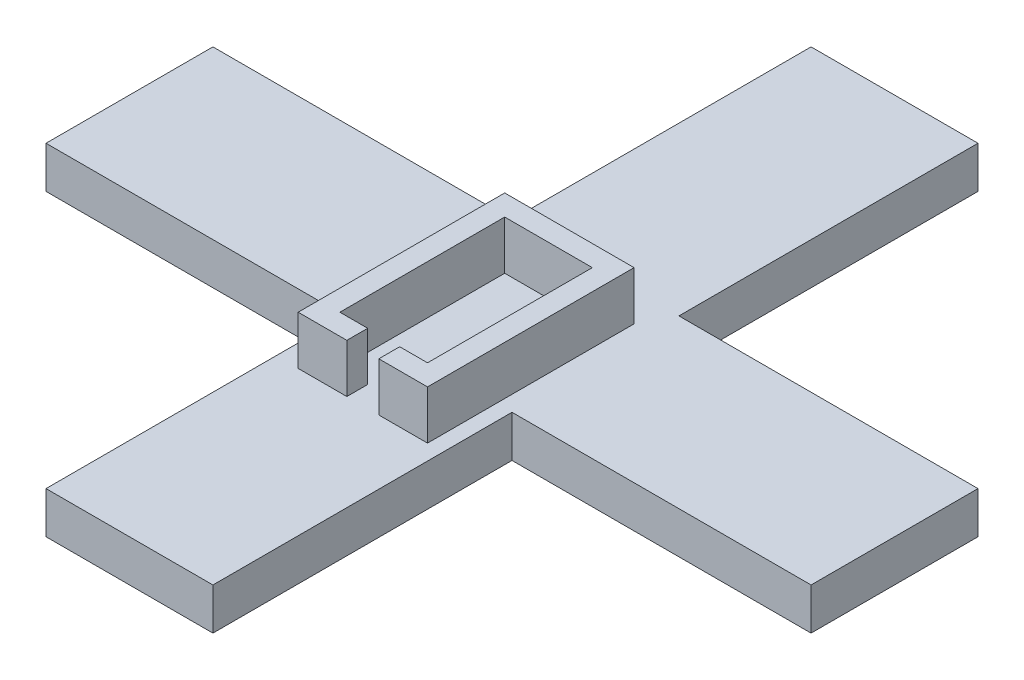
ISO-10303-21;
HEADER;
FILE_DESCRIPTION(('STEP AP214'),'2;1');
FILE_NAME('part.step','',(''),(''),'','','');
FILE_SCHEMA(('AUTOMOTIVE_DESIGN { 1 0 10303 214 1 1 1 1 }'));
ENDSEC;
DATA;
#1=APPLICATION_CONTEXT('core data for automotive mechanical design processes');
#2=APPLICATION_PROTOCOL_DEFINITION('international standard','automotive_design',2000,#1);
#3=PRODUCT_CONTEXT('',#1,'mechanical');
#4=PRODUCT('Part','Part','',(#3));
#5=PRODUCT_RELATED_PRODUCT_CATEGORY('part','',(#4));
#6=PRODUCT_DEFINITION_FORMATION('','',#4);
#7=PRODUCT_DEFINITION_CONTEXT('part definition',#1,'design');
#8=PRODUCT_DEFINITION('design','',#6,#7);
#9=PRODUCT_DEFINITION_SHAPE('','',#8);
#10=(LENGTH_UNIT() NAMED_UNIT(*) SI_UNIT(.MILLI.,.METRE.));
#11=(NAMED_UNIT(*) PLANE_ANGLE_UNIT() SI_UNIT($,.RADIAN.));
#12=(NAMED_UNIT(*) SI_UNIT($,.STERADIAN.) SOLID_ANGLE_UNIT());
#13=UNCERTAINTY_MEASURE_WITH_UNIT(LENGTH_MEASURE(1.E-05),#10,'distance_accuracy_value','');
#14=(GEOMETRIC_REPRESENTATION_CONTEXT(3) GLOBAL_UNCERTAINTY_ASSIGNED_CONTEXT((#13)) GLOBAL_UNIT_ASSIGNED_CONTEXT((#10,
#11,#12)) REPRESENTATION_CONTEXT('',''));
#15=CARTESIAN_POINT('',(0.,0.,0.));
#16=DIRECTION('',(0.,0.,1.));
#17=DIRECTION('',(1.,0.,0.));
#18=AXIS2_PLACEMENT_3D('',#15,#16,#17);
#19=CARTESIAN_POINT('',(0.,6.,0.));
#20=DIRECTION('',(0.,1.,0.));
#21=DIRECTION('',(0.,0.,1.));
#22=AXIS2_PLACEMENT_3D('',#19,#20,#21);
#23=PLANE('',#22);
#24=DIRECTION('',(-1.,0.,0.));
#25=VECTOR('',#24,1.);
#26=CARTESIAN_POINT('',(12.,6.,-55.));
#27=LINE('',#26,#25);
#28=CARTESIAN_POINT('',(12.,6.,-55.));
#29=VERTEX_POINT('',#28);
#30=CARTESIAN_POINT('',(-12.,6.,-55.));
#31=VERTEX_POINT('',#30);
#32=EDGE_CURVE('E115',#29,#31,#27,.T.);
#33=ORIENTED_EDGE('',*,*,#32,.T.);
#34=DIRECTION('',(0.,0.,1.));
#35=VECTOR('',#34,1.);
#36=CARTESIAN_POINT('',(-12.,6.,-55.));
#37=LINE('',#36,#35);
#38=CARTESIAN_POINT('',(-12.,6.,-12.));
#39=VERTEX_POINT('',#38);
#40=EDGE_CURVE('E297',#31,#39,#37,.T.);
#41=ORIENTED_EDGE('',*,*,#40,.T.);
#42=DIRECTION('',(-1.,0.,0.));
#43=VECTOR('',#42,1.);
#44=CARTESIAN_POINT('',(-12.,6.,-12.));
#45=LINE('',#44,#43);
#46=CARTESIAN_POINT('',(-55.,6.,-12.));
#47=VERTEX_POINT('',#46);
#48=EDGE_CURVE('E251',#39,#47,#45,.T.);
#49=ORIENTED_EDGE('',*,*,#48,.T.);
#50=DIRECTION('',(0.,0.,1.));
#51=VECTOR('',#50,1.);
#52=CARTESIAN_POINT('',(-55.,6.,0.));
#53=LINE('',#52,#51);
#54=CARTESIAN_POINT('',(-55.,6.,12.));
#55=VERTEX_POINT('',#54);
#56=EDGE_CURVE('E269',#47,#55,#53,.T.);
#57=ORIENTED_EDGE('',*,*,#56,.T.);
#58=DIRECTION('',(1.,0.,0.));
#59=VECTOR('',#58,1.);
#60=CARTESIAN_POINT('',(-55.,6.,12.));
#61=LINE('',#60,#59);
#62=CARTESIAN_POINT('',(-12.,6.,12.));
#63=VERTEX_POINT('',#62);
#64=EDGE_CURVE('E265',#55,#63,#61,.T.);
#65=ORIENTED_EDGE('',*,*,#64,.T.);
#66=DIRECTION('',(0.,0.,1.));
#67=VECTOR('',#66,1.);
#68=CARTESIAN_POINT('',(-12.,6.,12.));
#69=LINE('',#68,#67);
#70=CARTESIAN_POINT('',(-12.,6.,55.));
#71=VERTEX_POINT('',#70);
#72=EDGE_CURVE('E268',#63,#71,#69,.T.);
#73=ORIENTED_EDGE('',*,*,#72,.T.);
#74=DIRECTION('',(1.,0.,0.));
#75=VECTOR('',#74,1.);
#76=CARTESIAN_POINT('',(-12.,6.,55.));
#77=LINE('',#76,#75);
#78=CARTESIAN_POINT('',(12.,6.,55.));
#79=VERTEX_POINT('',#78);
#80=EDGE_CURVE('E273',#71,#79,#77,.T.);
#81=ORIENTED_EDGE('',*,*,#80,.T.);
#82=DIRECTION('',(0.,0.,-1.));
#83=VECTOR('',#82,1.);
#84=CARTESIAN_POINT('',(12.,6.,55.));
#85=LINE('',#84,#83);
#86=CARTESIAN_POINT('',(12.,6.,12.));
#87=VERTEX_POINT('',#86);
#88=EDGE_CURVE('E280',#79,#87,#85,.T.);
#89=ORIENTED_EDGE('',*,*,#88,.T.);
#90=DIRECTION('',(1.,0.,0.));
#91=VECTOR('',#90,1.);
#92=CARTESIAN_POINT('',(12.,6.,12.));
#93=LINE('',#92,#91);
#94=CARTESIAN_POINT('',(55.,6.,12.));
#95=VERTEX_POINT('',#94);
#96=EDGE_CURVE('E150',#87,#95,#93,.T.);
#97=ORIENTED_EDGE('',*,*,#96,.T.);
#98=DIRECTION('',(0.,0.,-1.));
#99=VECTOR('',#98,1.);
#100=CARTESIAN_POINT('',(55.,6.,0.));
#101=LINE('',#100,#99);
#102=CARTESIAN_POINT('',(55.,6.,-12.));
#103=VERTEX_POINT('',#102);
#104=EDGE_CURVE('E143',#95,#103,#101,.T.);
#105=ORIENTED_EDGE('',*,*,#104,.T.);
#106=DIRECTION('',(-1.,0.,0.));
#107=VECTOR('',#106,1.);
#108=CARTESIAN_POINT('',(55.,6.,-12.));
#109=LINE('',#108,#107);
#110=CARTESIAN_POINT('',(12.,6.,-12.));
#111=VERTEX_POINT('',#110);
#112=EDGE_CURVE('E147',#103,#111,#109,.T.);
#113=ORIENTED_EDGE('',*,*,#112,.T.);
#114=DIRECTION('',(0.,0.,-1.));
#115=VECTOR('',#114,1.);
#116=CARTESIAN_POINT('',(12.,6.,-12.));
#117=LINE('',#116,#115);
#118=EDGE_CURVE('E64',#111,#29,#117,.T.);
#119=ORIENTED_EDGE('',*,*,#118,.T.);
#120=EDGE_LOOP('',(#33,#41,#49,#57,#65,#73,#81,#89,#97,#105,#113,#119));
#121=FACE_BOUND('',#120,.T.);
#122=DIRECTION('',(-1.,0.,0.));
#123=VECTOR('',#122,1.);
#124=CARTESIAN_POINT('',(0.,6.,21.9127301864317));
#125=LINE('',#124,#123);
#126=CARTESIAN_POINT('',(-1.83428157367448,6.,21.9127301864317));
#127=VERTEX_POINT('',#126);
#128=CARTESIAN_POINT('',(-8.83428157367449,6.,21.9127301864317));
#129=VERTEX_POINT('',#128);
#130=EDGE_CURVE('E634',#127,#129,#125,.T.);
#131=ORIENTED_EDGE('',*,*,#130,.T.);
#132=DIRECTION('',(0.,0.,-1.));
#133=VECTOR('',#132,1.);
#134=CARTESIAN_POINT('',(-8.83428157367449,6.,0.));
#135=LINE('',#134,#133);
#136=CARTESIAN_POINT('',(-8.83428157367449,6.,-7.78726981356826));
#137=VERTEX_POINT('',#136);
#138=EDGE_CURVE('E178',#129,#137,#135,.T.);
#139=ORIENTED_EDGE('',*,*,#138,.T.);
#140=DIRECTION('',(1.,0.,0.));
#141=VECTOR('',#140,1.);
#142=CARTESIAN_POINT('',(0.,6.,-7.78726981356826));
#143=LINE('',#142,#141);
#144=CARTESIAN_POINT('',(9.76571842632552,6.,-7.78726981356826));
#145=VERTEX_POINT('',#144);
#146=EDGE_CURVE('E587',#137,#145,#143,.T.);
#147=ORIENTED_EDGE('',*,*,#146,.T.);
#148=DIRECTION('',(0.,0.,1.));
#149=VECTOR('',#148,1.);
#150=CARTESIAN_POINT('',(9.76571842632552,6.,0.));
#151=LINE('',#150,#149);
#152=CARTESIAN_POINT('',(9.76571842632552,6.,21.9127301864317));
#153=VERTEX_POINT('',#152);
#154=EDGE_CURVE('E593',#145,#153,#151,.T.);
#155=ORIENTED_EDGE('',*,*,#154,.T.);
#156=DIRECTION('',(-1.,0.,0.));
#157=VECTOR('',#156,1.);
#158=CARTESIAN_POINT('',(0.,6.,21.9127301864317));
#159=LINE('',#158,#157);
#160=CARTESIAN_POINT('',(2.76571842632552,6.,21.9127301864317));
#161=VERTEX_POINT('',#160);
#162=EDGE_CURVE('E603',#153,#161,#159,.T.);
#163=ORIENTED_EDGE('',*,*,#162,.T.);
#164=DIRECTION('',(0.,0.,-1.));
#165=VECTOR('',#164,1.);
#166=CARTESIAN_POINT('',(2.76571842632552,6.,0.));
#167=LINE('',#166,#165);
#168=CARTESIAN_POINT('',(2.76571842632552,6.,18.9127301864317));
#169=VERTEX_POINT('',#168);
#170=EDGE_CURVE('E607',#161,#169,#167,.T.);
#171=ORIENTED_EDGE('',*,*,#170,.T.);
#172=DIRECTION('',(1.,0.,0.));
#173=VECTOR('',#172,1.);
#174=CARTESIAN_POINT('',(0.,6.,18.9127301864317));
#175=LINE('',#174,#173);
#176=CARTESIAN_POINT('',(6.76571842632552,6.,18.9127301864317));
#177=VERTEX_POINT('',#176);
#178=EDGE_CURVE('E611',#169,#177,#175,.T.);
#179=ORIENTED_EDGE('',*,*,#178,.T.);
#180=DIRECTION('',(0.,0.,-1.));
#181=VECTOR('',#180,1.);
#182=CARTESIAN_POINT('',(6.76571842632552,6.,0.));
#183=LINE('',#182,#181);
#184=CARTESIAN_POINT('',(6.76571842632552,6.,-4.78726981356826));
#185=VERTEX_POINT('',#184);
#186=EDGE_CURVE('E615',#177,#185,#183,.T.);
#187=ORIENTED_EDGE('',*,*,#186,.T.);
#188=DIRECTION('',(-1.,0.,0.));
#189=VECTOR('',#188,1.);
#190=CARTESIAN_POINT('',(0.,6.,-4.78726981356826));
#191=LINE('',#190,#189);
#192=CARTESIAN_POINT('',(-5.83428157367449,6.,-4.78726981356826));
#193=VERTEX_POINT('',#192);
#194=EDGE_CURVE('E619',#185,#193,#191,.T.);
#195=ORIENTED_EDGE('',*,*,#194,.T.);
#196=DIRECTION('',(0.,0.,1.));
#197=VECTOR('',#196,1.);
#198=CARTESIAN_POINT('',(-5.83428157367449,6.,0.));
#199=LINE('',#198,#197);
#200=CARTESIAN_POINT('',(-5.83428157367448,6.,18.9127301864317));
#201=VERTEX_POINT('',#200);
#202=EDGE_CURVE('E623',#193,#201,#199,.T.);
#203=ORIENTED_EDGE('',*,*,#202,.T.);
#204=DIRECTION('',(1.,0.,0.));
#205=VECTOR('',#204,1.);
#206=CARTESIAN_POINT('',(0.,6.,18.9127301864317));
#207=LINE('',#206,#205);
#208=CARTESIAN_POINT('',(-1.83428157367448,6.,18.9127301864317));
#209=VERTEX_POINT('',#208);
#210=EDGE_CURVE('E627',#201,#209,#207,.T.);
#211=ORIENTED_EDGE('',*,*,#210,.T.);
#212=DIRECTION('',(0.,0.,1.));
#213=VECTOR('',#212,1.);
#214=CARTESIAN_POINT('',(-1.83428157367448,6.,0.));
#215=LINE('',#214,#213);
#216=EDGE_CURVE('E631',#209,#127,#215,.T.);
#217=ORIENTED_EDGE('',*,*,#216,.T.);
#218=EDGE_LOOP('',(#131,#139,#147,#155,#163,#171,#179,#187,#195,#203,#211,#217));
#219=FACE_BOUND('',#218,.T.);
#220=ADVANCED_FACE('F39',(#121,#219),#23,.T.);
#221=CARTESIAN_POINT('',(0.,6.,-55.));
#222=DIRECTION('',(0.,0.,1.));
#223=DIRECTION('',(1.,0.,0.));
#224=AXIS2_PLACEMENT_3D('',#221,#222,#223);
#225=PLANE('',#224);
#226=DIRECTION('',(-1.,0.,0.));
#227=VECTOR('',#226,1.);
#228=CARTESIAN_POINT('',(0.,0.,-55.));
#229=LINE('',#228,#227);
#230=CARTESIAN_POINT('',(12.,0.,-55.));
#231=VERTEX_POINT('',#230);
#232=CARTESIAN_POINT('',(-12.,0.,-55.));
#233=VERTEX_POINT('',#232);
#234=EDGE_CURVE('E109',#231,#233,#229,.T.);
#235=ORIENTED_EDGE('',*,*,#234,.T.);
#236=DIRECTION('',(0.,-1.,0.));
#237=VECTOR('',#236,1.);
#238=CARTESIAN_POINT('',(-12.,6.,-55.));
#239=LINE('',#238,#237);
#240=EDGE_CURVE('E11',#31,#233,#239,.T.);
#241=ORIENTED_EDGE('',*,*,#240,.F.);
#242=ORIENTED_EDGE('',*,*,#32,.F.);
#243=DIRECTION('',(0.,-1.,0.));
#244=VECTOR('',#243,1.);
#245=CARTESIAN_POINT('',(12.,6.,-55.));
#246=LINE('',#245,#244);
#247=EDGE_CURVE('E171',#29,#231,#246,.T.);
#248=ORIENTED_EDGE('',*,*,#247,.T.);
#249=EDGE_LOOP('',(#235,#241,#242,#248));
#250=FACE_BOUND('',#249,.T.);
#251=ADVANCED_FACE('F41',(#250),#225,.F.);
#252=CARTESIAN_POINT('',(-12.,6.,-55.));
#253=DIRECTION('',(1.,0.,0.));
#254=DIRECTION('',(0.,0.,-1.));
#255=AXIS2_PLACEMENT_3D('',#252,#253,#254);
#256=PLANE('',#255);
#257=DIRECTION('',(0.,0.,1.));
#258=VECTOR('',#257,1.);
#259=CARTESIAN_POINT('',(-12.,0.,-55.));
#260=LINE('',#259,#258);
#261=CARTESIAN_POINT('',(-12.,0.,-12.));
#262=VERTEX_POINT('',#261);
#263=EDGE_CURVE('E177',#233,#262,#260,.T.);
#264=ORIENTED_EDGE('',*,*,#263,.T.);
#265=DIRECTION('',(0.,-1.,0.));
#266=VECTOR('',#265,1.);
#267=CARTESIAN_POINT('',(-12.,6.,-12.));
#268=LINE('',#267,#266);
#269=EDGE_CURVE('E48',#39,#262,#268,.T.);
#270=ORIENTED_EDGE('',*,*,#269,.F.);
#271=ORIENTED_EDGE('',*,*,#40,.F.);
#272=ORIENTED_EDGE('',*,*,#240,.T.);
#273=EDGE_LOOP('',(#264,#270,#271,#272));
#274=FACE_BOUND('',#273,.T.);
#275=ADVANCED_FACE('F304',(#274),#256,.F.);
#276=CARTESIAN_POINT('',(-12.,6.,-12.));
#277=DIRECTION('',(0.,0.,1.));
#278=DIRECTION('',(1.,0.,0.));
#279=AXIS2_PLACEMENT_3D('',#276,#277,#278);
#280=PLANE('',#279);
#281=DIRECTION('',(-1.,0.,0.));
#282=VECTOR('',#281,1.);
#283=CARTESIAN_POINT('',(-12.,0.,-12.));
#284=LINE('',#283,#282);
#285=CARTESIAN_POINT('',(-55.,0.,-12.));
#286=VERTEX_POINT('',#285);
#287=EDGE_CURVE('E181',#262,#286,#284,.T.);
#288=ORIENTED_EDGE('',*,*,#287,.T.);
#289=DIRECTION('',(0.,-1.,0.));
#290=VECTOR('',#289,1.);
#291=CARTESIAN_POINT('',(-55.,6.,-12.));
#292=LINE('',#291,#290);
#293=EDGE_CURVE('E240',#47,#286,#292,.T.);
#294=ORIENTED_EDGE('',*,*,#293,.F.);
#295=ORIENTED_EDGE('',*,*,#48,.F.);
#296=ORIENTED_EDGE('',*,*,#269,.T.);
#297=EDGE_LOOP('',(#288,#294,#295,#296));
#298=FACE_BOUND('',#297,.T.);
#299=ADVANCED_FACE('F249',(#298),#280,.F.);
#300=CARTESIAN_POINT('',(-55.,6.,12.));
#301=DIRECTION('',(1.,0.,0.));
#302=DIRECTION('',(0.,0.,-1.));
#303=AXIS2_PLACEMENT_3D('',#300,#301,#302);
#304=PLANE('',#303);
#305=DIRECTION('',(0.,0.,1.));
#306=VECTOR('',#305,1.);
#307=CARTESIAN_POINT('',(-55.,0.,12.));
#308=LINE('',#307,#306);
#309=CARTESIAN_POINT('',(-55.,0.,12.));
#310=VERTEX_POINT('',#309);
#311=EDGE_CURVE('E185',#286,#310,#308,.T.);
#312=ORIENTED_EDGE('',*,*,#311,.T.);
#313=DIRECTION('',(0.,-1.,0.));
#314=VECTOR('',#313,1.);
#315=CARTESIAN_POINT('',(-55.,6.,12.));
#316=LINE('',#315,#314);
#317=EDGE_CURVE('E236',#55,#310,#316,.T.);
#318=ORIENTED_EDGE('',*,*,#317,.F.);
#319=ORIENTED_EDGE('',*,*,#56,.F.);
#320=ORIENTED_EDGE('',*,*,#293,.T.);
#321=EDGE_LOOP('',(#312,#318,#319,#320));
#322=FACE_BOUND('',#321,.T.);
#323=ADVANCED_FACE('F259',(#322),#304,.F.);
#324=CARTESIAN_POINT('',(-55.,6.,12.));
#325=DIRECTION('',(0.,0.,-1.));
#326=DIRECTION('',(-1.,0.,0.));
#327=AXIS2_PLACEMENT_3D('',#324,#325,#326);
#328=PLANE('',#327);
#329=DIRECTION('',(1.,0.,0.));
#330=VECTOR('',#329,1.);
#331=CARTESIAN_POINT('',(-55.,0.,12.));
#332=LINE('',#331,#330);
#333=CARTESIAN_POINT('',(-12.,0.,12.));
#334=VERTEX_POINT('',#333);
#335=EDGE_CURVE('E188',#310,#334,#332,.T.);
#336=ORIENTED_EDGE('',*,*,#335,.T.);
#337=DIRECTION('',(0.,-1.,0.));
#338=VECTOR('',#337,1.);
#339=CARTESIAN_POINT('',(-12.,6.,12.));
#340=LINE('',#339,#338);
#341=EDGE_CURVE('E232',#63,#334,#340,.T.);
#342=ORIENTED_EDGE('',*,*,#341,.F.);
#343=ORIENTED_EDGE('',*,*,#64,.F.);
#344=ORIENTED_EDGE('',*,*,#317,.T.);
#345=EDGE_LOOP('',(#336,#342,#343,#344));
#346=FACE_BOUND('',#345,.T.);
#347=ADVANCED_FACE('F263',(#346),#328,.F.);
#348=CARTESIAN_POINT('',(-12.,6.,12.));
#349=DIRECTION('',(1.,0.,0.));
#350=DIRECTION('',(0.,0.,-1.));
#351=AXIS2_PLACEMENT_3D('',#348,#349,#350);
#352=PLANE('',#351);
#353=DIRECTION('',(0.,0.,1.));
#354=VECTOR('',#353,1.);
#355=CARTESIAN_POINT('',(-12.,0.,12.));
#356=LINE('',#355,#354);
#357=CARTESIAN_POINT('',(-12.,0.,55.));
#358=VERTEX_POINT('',#357);
#359=EDGE_CURVE('E191',#334,#358,#356,.T.);
#360=ORIENTED_EDGE('',*,*,#359,.T.);
#361=DIRECTION('',(0.,-1.,0.));
#362=VECTOR('',#361,1.);
#363=CARTESIAN_POINT('',(-12.,6.,55.));
#364=LINE('',#363,#362);
#365=EDGE_CURVE('E228',#71,#358,#364,.T.);
#366=ORIENTED_EDGE('',*,*,#365,.F.);
#367=ORIENTED_EDGE('',*,*,#72,.F.);
#368=ORIENTED_EDGE('',*,*,#341,.T.);
#369=EDGE_LOOP('',(#360,#366,#367,#368));
#370=FACE_BOUND('',#369,.T.);
#371=ADVANCED_FACE('F334',(#370),#352,.F.);
#372=CARTESIAN_POINT('',(0.,6.,55.));
#373=DIRECTION('',(0.,0.,-1.));
#374=DIRECTION('',(-1.,0.,0.));
#375=AXIS2_PLACEMENT_3D('',#372,#373,#374);
#376=PLANE('',#375);
#377=DIRECTION('',(1.,0.,0.));
#378=VECTOR('',#377,1.);
#379=CARTESIAN_POINT('',(0.,0.,55.));
#380=LINE('',#379,#378);
#381=CARTESIAN_POINT('',(12.,0.,55.));
#382=VERTEX_POINT('',#381);
#383=EDGE_CURVE('E195',#358,#382,#380,.T.);
#384=ORIENTED_EDGE('',*,*,#383,.T.);
#385=DIRECTION('',(0.,-1.,0.));
#386=VECTOR('',#385,1.);
#387=CARTESIAN_POINT('',(12.,6.,55.));
#388=LINE('',#387,#386);
#389=EDGE_CURVE('E224',#79,#382,#388,.T.);
#390=ORIENTED_EDGE('',*,*,#389,.F.);
#391=ORIENTED_EDGE('',*,*,#80,.F.);
#392=ORIENTED_EDGE('',*,*,#365,.T.);
#393=EDGE_LOOP('',(#384,#390,#391,#392));
#394=FACE_BOUND('',#393,.T.);
#395=ADVANCED_FACE('F331',(#394),#376,.F.);
#396=CARTESIAN_POINT('',(12.,6.,55.));
#397=DIRECTION('',(-1.,0.,0.));
#398=DIRECTION('',(0.,0.,1.));
#399=AXIS2_PLACEMENT_3D('',#396,#397,#398);
#400=PLANE('',#399);
#401=DIRECTION('',(0.,0.,-1.));
#402=VECTOR('',#401,1.);
#403=CARTESIAN_POINT('',(12.,0.,55.));
#404=LINE('',#403,#402);
#405=CARTESIAN_POINT('',(12.,0.,12.));
#406=VERTEX_POINT('',#405);
#407=EDGE_CURVE('E198',#382,#406,#404,.T.);
#408=ORIENTED_EDGE('',*,*,#407,.T.);
#409=DIRECTION('',(0.,-1.,0.));
#410=VECTOR('',#409,1.);
#411=CARTESIAN_POINT('',(12.,6.,12.));
#412=LINE('',#411,#410);
#413=EDGE_CURVE('E220',#87,#406,#412,.T.);
#414=ORIENTED_EDGE('',*,*,#413,.F.);
#415=ORIENTED_EDGE('',*,*,#88,.F.);
#416=ORIENTED_EDGE('',*,*,#389,.T.);
#417=EDGE_LOOP('',(#408,#414,#415,#416));
#418=FACE_BOUND('',#417,.T.);
#419=ADVANCED_FACE('F288',(#418),#400,.F.);
#420=CARTESIAN_POINT('',(12.,6.,12.));
#421=DIRECTION('',(0.,0.,-1.));
#422=DIRECTION('',(-1.,0.,0.));
#423=AXIS2_PLACEMENT_3D('',#420,#421,#422);
#424=PLANE('',#423);
#425=DIRECTION('',(1.,0.,0.));
#426=VECTOR('',#425,1.);
#427=CARTESIAN_POINT('',(12.,0.,12.));
#428=LINE('',#427,#426);
#429=CARTESIAN_POINT('',(55.,0.,12.));
#430=VERTEX_POINT('',#429);
#431=EDGE_CURVE('E201',#406,#430,#428,.T.);
#432=ORIENTED_EDGE('',*,*,#431,.T.);
#433=DIRECTION('',(0.,-1.,0.));
#434=VECTOR('',#433,1.);
#435=CARTESIAN_POINT('',(55.,6.,12.));
#436=LINE('',#435,#434);
#437=EDGE_CURVE('E163',#95,#430,#436,.T.);
#438=ORIENTED_EDGE('',*,*,#437,.F.);
#439=ORIENTED_EDGE('',*,*,#96,.F.);
#440=ORIENTED_EDGE('',*,*,#413,.T.);
#441=EDGE_LOOP('',(#432,#438,#439,#440));
#442=FACE_BOUND('',#441,.T.);
#443=ADVANCED_FACE('F292',(#442),#424,.F.);
#444=CARTESIAN_POINT('',(55.,6.,0.));
#445=DIRECTION('',(-1.,0.,0.));
#446=DIRECTION('',(0.,0.,1.));
#447=AXIS2_PLACEMENT_3D('',#444,#445,#446);
#448=PLANE('',#447);
#449=DIRECTION('',(0.,0.,-1.));
#450=VECTOR('',#449,1.);
#451=CARTESIAN_POINT('',(55.,0.,0.));
#452=LINE('',#451,#450);
#453=CARTESIAN_POINT('',(55.,0.,-12.));
#454=VERTEX_POINT('',#453);
#455=EDGE_CURVE('E159',#430,#454,#452,.T.);
#456=ORIENTED_EDGE('',*,*,#455,.T.);
#457=DIRECTION('',(0.,-1.,0.));
#458=VECTOR('',#457,1.);
#459=CARTESIAN_POINT('',(55.,6.,-12.));
#460=LINE('',#459,#458);
#461=EDGE_CURVE('E157',#103,#454,#460,.T.);
#462=ORIENTED_EDGE('',*,*,#461,.F.);
#463=ORIENTED_EDGE('',*,*,#104,.F.);
#464=ORIENTED_EDGE('',*,*,#437,.T.);
#465=EDGE_LOOP('',(#456,#462,#463,#464));
#466=FACE_BOUND('',#465,.T.);
#467=ADVANCED_FACE('F158',(#466),#448,.F.);
#468=CARTESIAN_POINT('',(55.,6.,-12.));
#469=DIRECTION('',(0.,0.,1.));
#470=DIRECTION('',(1.,0.,0.));
#471=AXIS2_PLACEMENT_3D('',#468,#469,#470);
#472=PLANE('',#471);
#473=DIRECTION('',(-1.,0.,0.));
#474=VECTOR('',#473,1.);
#475=CARTESIAN_POINT('',(55.,0.,-12.));
#476=LINE('',#475,#474);
#477=CARTESIAN_POINT('',(12.,0.,-12.));
#478=VERTEX_POINT('',#477);
#479=EDGE_CURVE('E207',#454,#478,#476,.T.);
#480=ORIENTED_EDGE('',*,*,#479,.T.);
#481=DIRECTION('',(0.,-1.,0.));
#482=VECTOR('',#481,1.);
#483=CARTESIAN_POINT('',(12.,6.,-12.));
#484=LINE('',#483,#482);
#485=EDGE_CURVE('E164',#111,#478,#484,.T.);
#486=ORIENTED_EDGE('',*,*,#485,.F.);
#487=ORIENTED_EDGE('',*,*,#112,.F.);
#488=ORIENTED_EDGE('',*,*,#461,.T.);
#489=EDGE_LOOP('',(#480,#486,#487,#488));
#490=FACE_BOUND('',#489,.T.);
#491=ADVANCED_FACE('F166',(#490),#472,.F.);
#492=CARTESIAN_POINT('',(12.,6.,-12.));
#493=DIRECTION('',(-1.,0.,0.));
#494=DIRECTION('',(0.,0.,1.));
#495=AXIS2_PLACEMENT_3D('',#492,#493,#494);
#496=PLANE('',#495);
#497=DIRECTION('',(0.,0.,-1.));
#498=VECTOR('',#497,1.);
#499=CARTESIAN_POINT('',(12.,0.,-12.));
#500=LINE('',#499,#498);
#501=EDGE_CURVE('E210',#478,#231,#500,.T.);
#502=ORIENTED_EDGE('',*,*,#501,.T.);
#503=ORIENTED_EDGE('',*,*,#247,.F.);
#504=ORIENTED_EDGE('',*,*,#118,.F.);
#505=ORIENTED_EDGE('',*,*,#485,.T.);
#506=EDGE_LOOP('',(#502,#503,#504,#505));
#507=FACE_BOUND('',#506,.T.);
#508=ADVANCED_FACE('F294',(#507),#496,.F.);
#509=CARTESIAN_POINT('',(0.,0.,0.));
#510=DIRECTION('',(0.,1.,0.));
#511=DIRECTION('',(0.,0.,1.));
#512=AXIS2_PLACEMENT_3D('',#509,#510,#511);
#513=PLANE('',#512);
#514=ORIENTED_EDGE('',*,*,#234,.F.);
#515=ORIENTED_EDGE('',*,*,#501,.F.);
#516=ORIENTED_EDGE('',*,*,#479,.F.);
#517=ORIENTED_EDGE('',*,*,#455,.F.);
#518=ORIENTED_EDGE('',*,*,#431,.F.);
#519=ORIENTED_EDGE('',*,*,#407,.F.);
#520=ORIENTED_EDGE('',*,*,#383,.F.);
#521=ORIENTED_EDGE('',*,*,#359,.F.);
#522=ORIENTED_EDGE('',*,*,#335,.F.);
#523=ORIENTED_EDGE('',*,*,#311,.F.);
#524=ORIENTED_EDGE('',*,*,#287,.F.);
#525=ORIENTED_EDGE('',*,*,#263,.F.);
#526=EDGE_LOOP('',(#514,#515,#516,#517,#518,#519,#520,#521,#522,#523,#524,#525));
#527=FACE_BOUND('',#526,.T.);
#528=ADVANCED_FACE('F254',(#527),#513,.F.);
#529=CARTESIAN_POINT('',(-8.83428157367449,13.,21.9127301864317));
#530=DIRECTION('',(1.,0.,0.));
#531=DIRECTION('',(0.,0.,-1.));
#532=AXIS2_PLACEMENT_3D('',#529,#530,#531);
#533=PLANE('',#532);
#534=ORIENTED_EDGE('',*,*,#138,.F.);
#535=DIRECTION('',(0.,-1.,0.));
#536=VECTOR('',#535,1.);
#537=CARTESIAN_POINT('',(-8.83428157367449,13.,21.9127301864317));
#538=LINE('',#537,#536);
#539=CARTESIAN_POINT('',(-8.83428157367449,13.,21.9127301864317));
#540=VERTEX_POINT('',#539);
#541=EDGE_CURVE('E582',#540,#129,#538,.T.);
#542=ORIENTED_EDGE('',*,*,#541,.F.);
#543=DIRECTION('',(0.,0.,1.));
#544=VECTOR('',#543,1.);
#545=CARTESIAN_POINT('',(-8.83428157367449,13.,21.9127301864317));
#546=LINE('',#545,#544);
#547=CARTESIAN_POINT('',(-8.83428157367449,13.,-7.78726981356826));
#548=VERTEX_POINT('',#547);
#549=EDGE_CURVE('E565',#548,#540,#546,.T.);
#550=ORIENTED_EDGE('',*,*,#549,.F.);
#551=DIRECTION('',(0.,-1.,0.));
#552=VECTOR('',#551,1.);
#553=CARTESIAN_POINT('',(-8.83428157367449,13.,-7.78726981356826));
#554=LINE('',#553,#552);
#555=EDGE_CURVE('E710',#548,#137,#554,.T.);
#556=ORIENTED_EDGE('',*,*,#555,.T.);
#557=EDGE_LOOP('',(#534,#542,#550,#556));
#558=FACE_BOUND('',#557,.T.);
#559=ADVANCED_FACE('F317',(#558),#533,.F.);
#560=CARTESIAN_POINT('',(-1.83428157367448,13.,21.9127301864317));
#561=DIRECTION('',(0.,0.,-1.));
#562=DIRECTION('',(-1.,0.,0.));
#563=AXIS2_PLACEMENT_3D('',#560,#561,#562);
#564=PLANE('',#563);
#565=ORIENTED_EDGE('',*,*,#130,.F.);
#566=DIRECTION('',(0.,-1.,0.));
#567=VECTOR('',#566,1.);
#568=CARTESIAN_POINT('',(-1.83428157367448,13.,21.9127301864317));
#569=LINE('',#568,#567);
#570=CARTESIAN_POINT('',(-1.83428157367448,13.,21.9127301864317));
#571=VERTEX_POINT('',#570);
#572=EDGE_CURVE('E588',#571,#127,#569,.T.);
#573=ORIENTED_EDGE('',*,*,#572,.F.);
#574=DIRECTION('',(1.,0.,0.));
#575=VECTOR('',#574,1.);
#576=CARTESIAN_POINT('',(-1.83428157367448,13.,21.9127301864317));
#577=LINE('',#576,#575);
#578=EDGE_CURVE('E570',#540,#571,#577,.T.);
#579=ORIENTED_EDGE('',*,*,#578,.F.);
#580=ORIENTED_EDGE('',*,*,#541,.T.);
#581=EDGE_LOOP('',(#565,#573,#579,#580));
#582=FACE_BOUND('',#581,.T.);
#583=ADVANCED_FACE('F388',(#582),#564,.F.);
#584=CARTESIAN_POINT('',(-1.83428157367448,13.,18.9127301864317));
#585=DIRECTION('',(-1.,0.,0.));
#586=DIRECTION('',(0.,0.,1.));
#587=AXIS2_PLACEMENT_3D('',#584,#585,#586);
#588=PLANE('',#587);
#589=ORIENTED_EDGE('',*,*,#216,.F.);
#590=DIRECTION('',(0.,-1.,0.));
#591=VECTOR('',#590,1.);
#592=CARTESIAN_POINT('',(-1.83428157367448,13.,18.9127301864317));
#593=LINE('',#592,#591);
#594=CARTESIAN_POINT('',(-1.83428157367448,13.,18.9127301864317));
#595=VERTEX_POINT('',#594);
#596=EDGE_CURVE('E596',#595,#209,#593,.T.);
#597=ORIENTED_EDGE('',*,*,#596,.F.);
#598=DIRECTION('',(0.,0.,-1.));
#599=VECTOR('',#598,1.);
#600=CARTESIAN_POINT('',(-1.83428157367448,13.,18.9127301864317));
#601=LINE('',#600,#599);
#602=EDGE_CURVE('E670',#571,#595,#601,.T.);
#603=ORIENTED_EDGE('',*,*,#602,.F.);
#604=ORIENTED_EDGE('',*,*,#572,.T.);
#605=EDGE_LOOP('',(#589,#597,#603,#604));
#606=FACE_BOUND('',#605,.T.);
#607=ADVANCED_FACE('F395',(#606),#588,.F.);
#608=CARTESIAN_POINT('',(-5.83428157367448,13.,18.9127301864317));
#609=DIRECTION('',(0.,0.,1.));
#610=DIRECTION('',(1.,0.,0.));
#611=AXIS2_PLACEMENT_3D('',#608,#609,#610);
#612=PLANE('',#611);
#613=ORIENTED_EDGE('',*,*,#210,.F.);
#614=DIRECTION('',(0.,-1.,0.));
#615=VECTOR('',#614,1.);
#616=CARTESIAN_POINT('',(-5.83428157367448,13.,18.9127301864317));
#617=LINE('',#616,#615);
#618=CARTESIAN_POINT('',(-5.83428157367448,13.,18.9127301864317));
#619=VERTEX_POINT('',#618);
#620=EDGE_CURVE('E675',#619,#201,#617,.T.);
#621=ORIENTED_EDGE('',*,*,#620,.F.);
#622=DIRECTION('',(-1.,0.,0.));
#623=VECTOR('',#622,1.);
#624=CARTESIAN_POINT('',(-5.83428157367448,13.,18.9127301864317));
#625=LINE('',#624,#623);
#626=EDGE_CURVE('E740',#595,#619,#625,.T.);
#627=ORIENTED_EDGE('',*,*,#626,.F.);
#628=ORIENTED_EDGE('',*,*,#596,.T.);
#629=EDGE_LOOP('',(#613,#621,#627,#628));
#630=FACE_BOUND('',#629,.T.);
#631=ADVANCED_FACE('F402',(#630),#612,.F.);
#632=CARTESIAN_POINT('',(-5.83428157367449,13.,-4.78726981356826));
#633=DIRECTION('',(-1.,0.,0.));
#634=DIRECTION('',(0.,0.,1.));
#635=AXIS2_PLACEMENT_3D('',#632,#633,#634);
#636=PLANE('',#635);
#637=ORIENTED_EDGE('',*,*,#202,.F.);
#638=DIRECTION('',(0.,-1.,0.));
#639=VECTOR('',#638,1.);
#640=CARTESIAN_POINT('',(-5.83428157367449,13.,-4.78726981356826));
#641=LINE('',#640,#639);
#642=CARTESIAN_POINT('',(-5.83428157367449,13.,-4.78726981356826));
#643=VERTEX_POINT('',#642);
#644=EDGE_CURVE('E682',#643,#193,#641,.T.);
#645=ORIENTED_EDGE('',*,*,#644,.F.);
#646=DIRECTION('',(0.,0.,-1.));
#647=VECTOR('',#646,1.);
#648=CARTESIAN_POINT('',(-5.83428157367449,13.,-4.78726981356826));
#649=LINE('',#648,#647);
#650=EDGE_CURVE('E680',#619,#643,#649,.T.);
#651=ORIENTED_EDGE('',*,*,#650,.F.);
#652=ORIENTED_EDGE('',*,*,#620,.T.);
#653=EDGE_LOOP('',(#637,#645,#651,#652));
#654=FACE_BOUND('',#653,.T.);
#655=ADVANCED_FACE('F410',(#654),#636,.F.);
#656=CARTESIAN_POINT('',(6.76571842632552,13.,-4.78726981356826));
#657=DIRECTION('',(0.,0.,-1.));
#658=DIRECTION('',(-1.,0.,0.));
#659=AXIS2_PLACEMENT_3D('',#656,#657,#658);
#660=PLANE('',#659);
#661=ORIENTED_EDGE('',*,*,#194,.F.);
#662=DIRECTION('',(0.,-1.,0.));
#663=VECTOR('',#662,1.);
#664=CARTESIAN_POINT('',(6.76571842632552,13.,-4.78726981356826));
#665=LINE('',#664,#663);
#666=CARTESIAN_POINT('',(6.76571842632552,13.,-4.78726981356826));
#667=VERTEX_POINT('',#666);
#668=EDGE_CURVE('E686',#667,#185,#665,.T.);
#669=ORIENTED_EDGE('',*,*,#668,.F.);
#670=DIRECTION('',(1.,0.,0.));
#671=VECTOR('',#670,1.);
#672=CARTESIAN_POINT('',(6.76571842632552,13.,-4.78726981356826));
#673=LINE('',#672,#671);
#674=EDGE_CURVE('E734',#643,#667,#673,.T.);
#675=ORIENTED_EDGE('',*,*,#674,.F.);
#676=ORIENTED_EDGE('',*,*,#644,.T.);
#677=EDGE_LOOP('',(#661,#669,#675,#676));
#678=FACE_BOUND('',#677,.T.);
#679=ADVANCED_FACE('F418',(#678),#660,.F.);
#680=CARTESIAN_POINT('',(6.76571842632552,13.,18.9127301864317));
#681=DIRECTION('',(1.,0.,0.));
#682=DIRECTION('',(0.,0.,-1.));
#683=AXIS2_PLACEMENT_3D('',#680,#681,#682);
#684=PLANE('',#683);
#685=ORIENTED_EDGE('',*,*,#186,.F.);
#686=DIRECTION('',(0.,-1.,0.));
#687=VECTOR('',#686,1.);
#688=CARTESIAN_POINT('',(6.76571842632552,13.,18.9127301864317));
#689=LINE('',#688,#687);
#690=CARTESIAN_POINT('',(6.76571842632552,13.,18.9127301864317));
#691=VERTEX_POINT('',#690);
#692=EDGE_CURVE('E692',#691,#177,#689,.T.);
#693=ORIENTED_EDGE('',*,*,#692,.F.);
#694=DIRECTION('',(0.,0.,1.));
#695=VECTOR('',#694,1.);
#696=CARTESIAN_POINT('',(6.76571842632552,13.,18.9127301864317));
#697=LINE('',#696,#695);
#698=EDGE_CURVE('E730',#667,#691,#697,.T.);
#699=ORIENTED_EDGE('',*,*,#698,.F.);
#700=ORIENTED_EDGE('',*,*,#668,.T.);
#701=EDGE_LOOP('',(#685,#693,#699,#700));
#702=FACE_BOUND('',#701,.T.);
#703=ADVANCED_FACE('F426',(#702),#684,.F.);
#704=CARTESIAN_POINT('',(2.76571842632552,13.,18.9127301864317));
#705=DIRECTION('',(0.,0.,1.));
#706=DIRECTION('',(1.,0.,0.));
#707=AXIS2_PLACEMENT_3D('',#704,#705,#706);
#708=PLANE('',#707);
#709=ORIENTED_EDGE('',*,*,#178,.F.);
#710=DIRECTION('',(0.,-1.,0.));
#711=VECTOR('',#710,1.);
#712=CARTESIAN_POINT('',(2.76571842632552,13.,18.9127301864317));
#713=LINE('',#712,#711);
#714=CARTESIAN_POINT('',(2.76571842632552,13.,18.9127301864317));
#715=VERTEX_POINT('',#714);
#716=EDGE_CURVE('E696',#715,#169,#713,.T.);
#717=ORIENTED_EDGE('',*,*,#716,.F.);
#718=DIRECTION('',(-1.,0.,0.));
#719=VECTOR('',#718,1.);
#720=CARTESIAN_POINT('',(2.76571842632552,13.,18.9127301864317));
#721=LINE('',#720,#719);
#722=EDGE_CURVE('E726',#691,#715,#721,.T.);
#723=ORIENTED_EDGE('',*,*,#722,.F.);
#724=ORIENTED_EDGE('',*,*,#692,.T.);
#725=EDGE_LOOP('',(#709,#717,#723,#724));
#726=FACE_BOUND('',#725,.T.);
#727=ADVANCED_FACE('F434',(#726),#708,.F.);
#728=CARTESIAN_POINT('',(2.76571842632552,13.,21.9127301864317));
#729=DIRECTION('',(1.,0.,0.));
#730=DIRECTION('',(0.,0.,-1.));
#731=AXIS2_PLACEMENT_3D('',#728,#729,#730);
#732=PLANE('',#731);
#733=ORIENTED_EDGE('',*,*,#170,.F.);
#734=DIRECTION('',(0.,-1.,0.));
#735=VECTOR('',#734,1.);
#736=CARTESIAN_POINT('',(2.76571842632552,13.,21.9127301864317));
#737=LINE('',#736,#735);
#738=CARTESIAN_POINT('',(2.76571842632552,13.,21.9127301864317));
#739=VERTEX_POINT('',#738);
#740=EDGE_CURVE('E700',#739,#161,#737,.T.);
#741=ORIENTED_EDGE('',*,*,#740,.F.);
#742=DIRECTION('',(0.,0.,1.));
#743=VECTOR('',#742,1.);
#744=CARTESIAN_POINT('',(2.76571842632552,13.,21.9127301864317));
#745=LINE('',#744,#743);
#746=EDGE_CURVE('E722',#715,#739,#745,.T.);
#747=ORIENTED_EDGE('',*,*,#746,.F.);
#748=ORIENTED_EDGE('',*,*,#716,.T.);
#749=EDGE_LOOP('',(#733,#741,#747,#748));
#750=FACE_BOUND('',#749,.T.);
#751=ADVANCED_FACE('F442',(#750),#732,.F.);
#752=CARTESIAN_POINT('',(9.76571842632552,13.,21.9127301864317));
#753=DIRECTION('',(0.,0.,-1.));
#754=DIRECTION('',(-1.,0.,0.));
#755=AXIS2_PLACEMENT_3D('',#752,#753,#754);
#756=PLANE('',#755);
#757=ORIENTED_EDGE('',*,*,#162,.F.);
#758=DIRECTION('',(0.,-1.,0.));
#759=VECTOR('',#758,1.);
#760=CARTESIAN_POINT('',(9.76571842632552,13.,21.9127301864317));
#761=LINE('',#760,#759);
#762=CARTESIAN_POINT('',(9.76571842632552,13.,21.9127301864317));
#763=VERTEX_POINT('',#762);
#764=EDGE_CURVE('E704',#763,#153,#761,.T.);
#765=ORIENTED_EDGE('',*,*,#764,.F.);
#766=DIRECTION('',(1.,0.,0.));
#767=VECTOR('',#766,1.);
#768=CARTESIAN_POINT('',(9.76571842632552,13.,21.9127301864317));
#769=LINE('',#768,#767);
#770=EDGE_CURVE('E718',#739,#763,#769,.T.);
#771=ORIENTED_EDGE('',*,*,#770,.F.);
#772=ORIENTED_EDGE('',*,*,#740,.T.);
#773=EDGE_LOOP('',(#757,#765,#771,#772));
#774=FACE_BOUND('',#773,.T.);
#775=ADVANCED_FACE('F450',(#774),#756,.F.);
#776=CARTESIAN_POINT('',(9.76571842632552,13.,-7.78726981356826));
#777=DIRECTION('',(-1.,0.,0.));
#778=DIRECTION('',(0.,0.,1.));
#779=AXIS2_PLACEMENT_3D('',#776,#777,#778);
#780=PLANE('',#779);
#781=ORIENTED_EDGE('',*,*,#154,.F.);
#782=DIRECTION('',(0.,-1.,0.));
#783=VECTOR('',#782,1.);
#784=CARTESIAN_POINT('',(9.76571842632552,13.,-7.78726981356826));
#785=LINE('',#784,#783);
#786=CARTESIAN_POINT('',(9.76571842632552,13.,-7.78726981356826));
#787=VERTEX_POINT('',#786);
#788=EDGE_CURVE('E55',#787,#145,#785,.T.);
#789=ORIENTED_EDGE('',*,*,#788,.F.);
#790=DIRECTION('',(0.,0.,-1.));
#791=VECTOR('',#790,1.);
#792=CARTESIAN_POINT('',(9.76571842632552,13.,-7.78726981356826));
#793=LINE('',#792,#791);
#794=EDGE_CURVE('E715',#763,#787,#793,.T.);
#795=ORIENTED_EDGE('',*,*,#794,.F.);
#796=ORIENTED_EDGE('',*,*,#764,.T.);
#797=EDGE_LOOP('',(#781,#789,#795,#796));
#798=FACE_BOUND('',#797,.T.);
#799=ADVANCED_FACE('F458',(#798),#780,.F.);
#800=CARTESIAN_POINT('',(-8.83428157367449,13.,-7.78726981356826));
#801=DIRECTION('',(0.,0.,1.));
#802=DIRECTION('',(1.,0.,0.));
#803=AXIS2_PLACEMENT_3D('',#800,#801,#802);
#804=PLANE('',#803);
#805=ORIENTED_EDGE('',*,*,#146,.F.);
#806=ORIENTED_EDGE('',*,*,#555,.F.);
#807=DIRECTION('',(-1.,0.,0.));
#808=VECTOR('',#807,1.);
#809=CARTESIAN_POINT('',(-8.83428157367449,13.,-7.78726981356826));
#810=LINE('',#809,#808);
#811=EDGE_CURVE('E574',#787,#548,#810,.T.);
#812=ORIENTED_EDGE('',*,*,#811,.F.);
#813=ORIENTED_EDGE('',*,*,#788,.T.);
#814=EDGE_LOOP('',(#805,#806,#812,#813));
#815=FACE_BOUND('',#814,.T.);
#816=ADVANCED_FACE('F466',(#815),#804,.F.);
#817=CARTESIAN_POINT('',(0.,13.,0.));
#818=DIRECTION('',(0.,-1.,0.));
#819=DIRECTION('',(0.,0.,-1.));
#820=AXIS2_PLACEMENT_3D('',#817,#818,#819);
#821=PLANE('',#820);
#822=ORIENTED_EDGE('',*,*,#549,.T.);
#823=ORIENTED_EDGE('',*,*,#578,.T.);
#824=ORIENTED_EDGE('',*,*,#602,.T.);
#825=ORIENTED_EDGE('',*,*,#626,.T.);
#826=ORIENTED_EDGE('',*,*,#650,.T.);
#827=ORIENTED_EDGE('',*,*,#674,.T.);
#828=ORIENTED_EDGE('',*,*,#698,.T.);
#829=ORIENTED_EDGE('',*,*,#722,.T.);
#830=ORIENTED_EDGE('',*,*,#746,.T.);
#831=ORIENTED_EDGE('',*,*,#770,.T.);
#832=ORIENTED_EDGE('',*,*,#794,.T.);
#833=ORIENTED_EDGE('',*,*,#811,.T.);
#834=EDGE_LOOP('',(#822,#823,#824,#825,#826,#827,#828,#829,#830,#831,#832,#833));
#835=FACE_BOUND('',#834,.T.);
#836=ADVANCED_FACE('F474',(#835),#821,.F.);
#837=CLOSED_SHELL('',(#220,#251,#275,#299,#323,#347,#371,#395,#419,#443,#467,#491,#508,#528,
#559,#583,#607,#631,#655,#679,#703,#727,#751,#775,#799,#816,#836));
#838=MANIFOLD_SOLID_BREP('B2',#837);
#839=ADVANCED_BREP_SHAPE_REPRESENTATION('',(#18,#838),#14);
#840=SHAPE_DEFINITION_REPRESENTATION(#9,#839);
ENDSEC;
END-ISO-10303-21;
